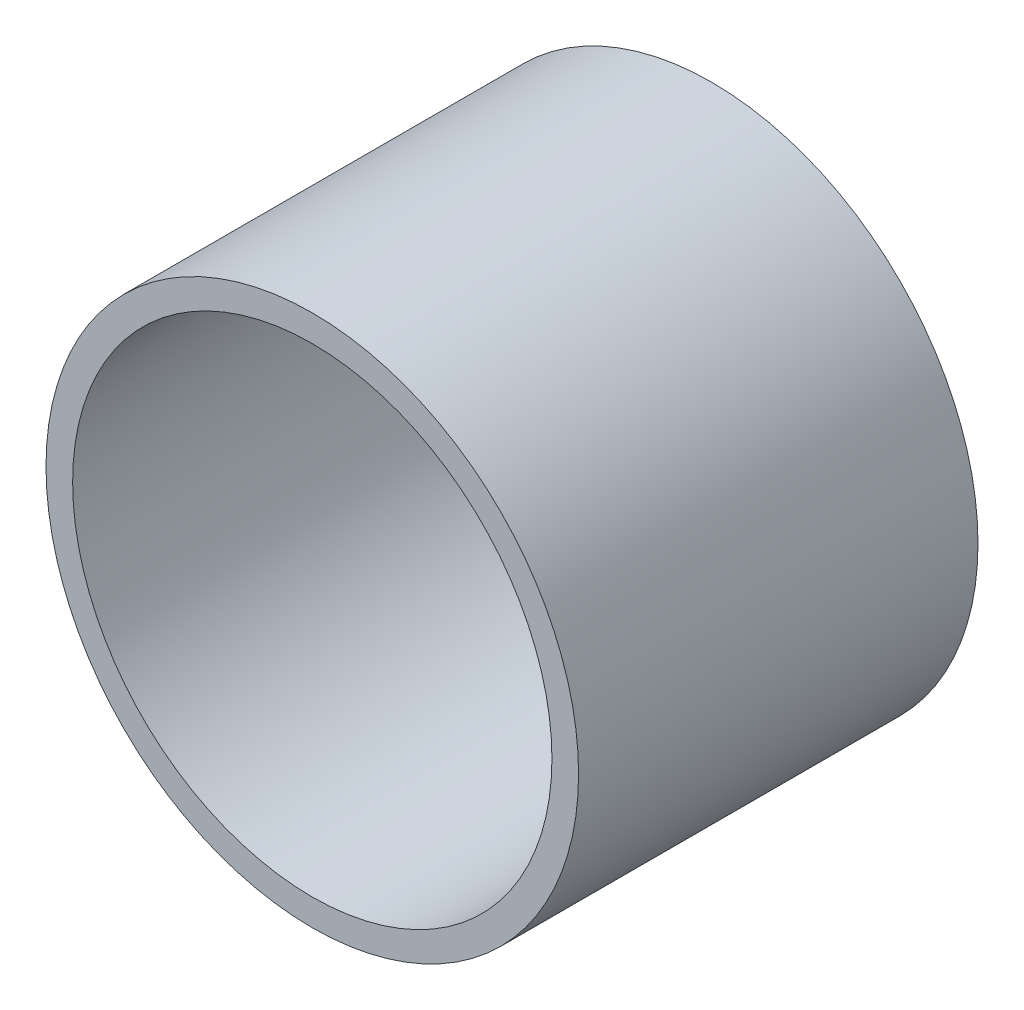
ISO-10303-21;
HEADER;
FILE_DESCRIPTION(('STEP AP214'),'2;1');
FILE_NAME('part.step','',(''),(''),'','','');
FILE_SCHEMA(('AUTOMOTIVE_DESIGN { 1 0 10303 214 1 1 1 1 }'));
ENDSEC;
DATA;
#1=APPLICATION_CONTEXT('core data for automotive mechanical design processes');
#2=APPLICATION_PROTOCOL_DEFINITION('international standard','automotive_design',2000,#1);
#3=PRODUCT_CONTEXT('',#1,'mechanical');
#4=PRODUCT('Part','Part','',(#3));
#5=PRODUCT_RELATED_PRODUCT_CATEGORY('part','',(#4));
#6=PRODUCT_DEFINITION_FORMATION('','',#4);
#7=PRODUCT_DEFINITION_CONTEXT('part definition',#1,'design');
#8=PRODUCT_DEFINITION('design','',#6,#7);
#9=PRODUCT_DEFINITION_SHAPE('','',#8);
#10=(LENGTH_UNIT() NAMED_UNIT(*) SI_UNIT(.MILLI.,.METRE.));
#11=(NAMED_UNIT(*) PLANE_ANGLE_UNIT() SI_UNIT($,.RADIAN.));
#12=(NAMED_UNIT(*) SI_UNIT($,.STERADIAN.) SOLID_ANGLE_UNIT());
#13=UNCERTAINTY_MEASURE_WITH_UNIT(LENGTH_MEASURE(1.E-05),#10,'distance_accuracy_value','');
#14=(GEOMETRIC_REPRESENTATION_CONTEXT(3) GLOBAL_UNCERTAINTY_ASSIGNED_CONTEXT((#13)) GLOBAL_UNIT_ASSIGNED_CONTEXT((#10,
#11,#12)) REPRESENTATION_CONTEXT('',''));
#15=CARTESIAN_POINT('',(0.,0.,0.));
#16=DIRECTION('',(0.,0.,1.));
#17=DIRECTION('',(1.,0.,0.));
#18=AXIS2_PLACEMENT_3D('',#15,#16,#17);
#19=CARTESIAN_POINT('',(0.,0.,30.));
#20=DIRECTION('',(0.,0.,-1.));
#21=DIRECTION('',(-1.,0.,0.));
#22=AXIS2_PLACEMENT_3D('',#19,#20,#21);
#23=CYLINDRICAL_SURFACE('',#22,20.);
#24=CARTESIAN_POINT('',(0.,0.,30.));
#25=DIRECTION('',(0.,0.,1.));
#26=DIRECTION('',(1.,0.,0.));
#27=AXIS2_PLACEMENT_3D('',#24,#25,#26);
#28=CIRCLE('',#27,20.);
#29=CARTESIAN_POINT('',(20.,0.,30.));
#30=VERTEX_POINT('',#29);
#31=EDGE_CURVE('E10',#30,#30,#28,.T.);
#32=ORIENTED_EDGE('',*,*,#31,.F.);
#33=EDGE_LOOP('',(#32));
#34=FACE_BOUND('',#33,.T.);
#35=CARTESIAN_POINT('',(0.,0.,0.));
#36=DIRECTION('',(0.,0.,1.));
#37=DIRECTION('',(1.,0.,0.));
#38=AXIS2_PLACEMENT_3D('',#35,#36,#37);
#39=CIRCLE('',#38,20.);
#40=CARTESIAN_POINT('',(20.,0.,0.));
#41=VERTEX_POINT('',#40);
#42=EDGE_CURVE('E34',#41,#41,#39,.T.);
#43=ORIENTED_EDGE('',*,*,#42,.T.);
#44=EDGE_LOOP('',(#43));
#45=FACE_BOUND('',#44,.T.);
#46=ADVANCED_FACE('F31',(#34,#45),#23,.T.);
#47=CARTESIAN_POINT('',(0.,0.,30.));
#48=DIRECTION('',(0.,0.,1.));
#49=DIRECTION('',(1.,0.,0.));
#50=AXIS2_PLACEMENT_3D('',#47,#48,#49);
#51=PLANE('',#50);
#52=CARTESIAN_POINT('',(0.,0.,30.));
#53=DIRECTION('',(0.,0.,1.));
#54=DIRECTION('',(1.,0.,0.));
#55=AXIS2_PLACEMENT_3D('',#52,#53,#54);
#56=CIRCLE('',#55,18.);
#57=CARTESIAN_POINT('',(18.,0.,30.));
#58=VERTEX_POINT('',#57);
#59=EDGE_CURVE('E43',#58,#58,#56,.T.);
#60=ORIENTED_EDGE('',*,*,#59,.F.);
#61=EDGE_LOOP('',(#60));
#62=FACE_BOUND('',#61,.T.);
#63=ORIENTED_EDGE('',*,*,#31,.T.);
#64=EDGE_LOOP('',(#63));
#65=FACE_BOUND('',#64,.T.);
#66=ADVANCED_FACE('F58',(#62,#65),#51,.T.);
#67=CARTESIAN_POINT('',(0.,0.,0.));
#68=DIRECTION('',(0.,0.,1.));
#69=DIRECTION('',(1.,0.,0.));
#70=AXIS2_PLACEMENT_3D('',#67,#68,#69);
#71=PLANE('',#70);
#72=CARTESIAN_POINT('',(0.,0.,0.));
#73=DIRECTION('',(0.,0.,1.));
#74=DIRECTION('',(1.,0.,0.));
#75=AXIS2_PLACEMENT_3D('',#72,#73,#74);
#76=CIRCLE('',#75,18.);
#77=CARTESIAN_POINT('',(18.,0.,0.));
#78=VERTEX_POINT('',#77);
#79=EDGE_CURVE('E41',#78,#78,#76,.T.);
#80=ORIENTED_EDGE('',*,*,#79,.T.);
#81=EDGE_LOOP('',(#80));
#82=FACE_BOUND('',#81,.T.);
#83=ORIENTED_EDGE('',*,*,#42,.F.);
#84=EDGE_LOOP('',(#83));
#85=FACE_BOUND('',#84,.T.);
#86=ADVANCED_FACE('F49',(#82,#85),#71,.F.);
#87=CARTESIAN_POINT('',(0.,0.,0.));
#88=DIRECTION('',(0.,0.,1.));
#89=DIRECTION('',(1.,0.,0.));
#90=AXIS2_PLACEMENT_3D('',#87,#88,#89);
#91=CYLINDRICAL_SURFACE('',#90,18.);
#92=ORIENTED_EDGE('',*,*,#79,.F.);
#93=EDGE_LOOP('',(#92));
#94=FACE_BOUND('',#93,.T.);
#95=ORIENTED_EDGE('',*,*,#59,.T.);
#96=EDGE_LOOP('',(#95));
#97=FACE_BOUND('',#96,.T.);
#98=ADVANCED_FACE('F52',(#94,#97),#91,.F.);
#99=CLOSED_SHELL('',(#46,#66,#86,#98));
#100=MANIFOLD_SOLID_BREP('B2',#99);
#101=ADVANCED_BREP_SHAPE_REPRESENTATION('',(#18,#100),#14);
#102=SHAPE_DEFINITION_REPRESENTATION(#9,#101);
ENDSEC;
END-ISO-10303-21;
